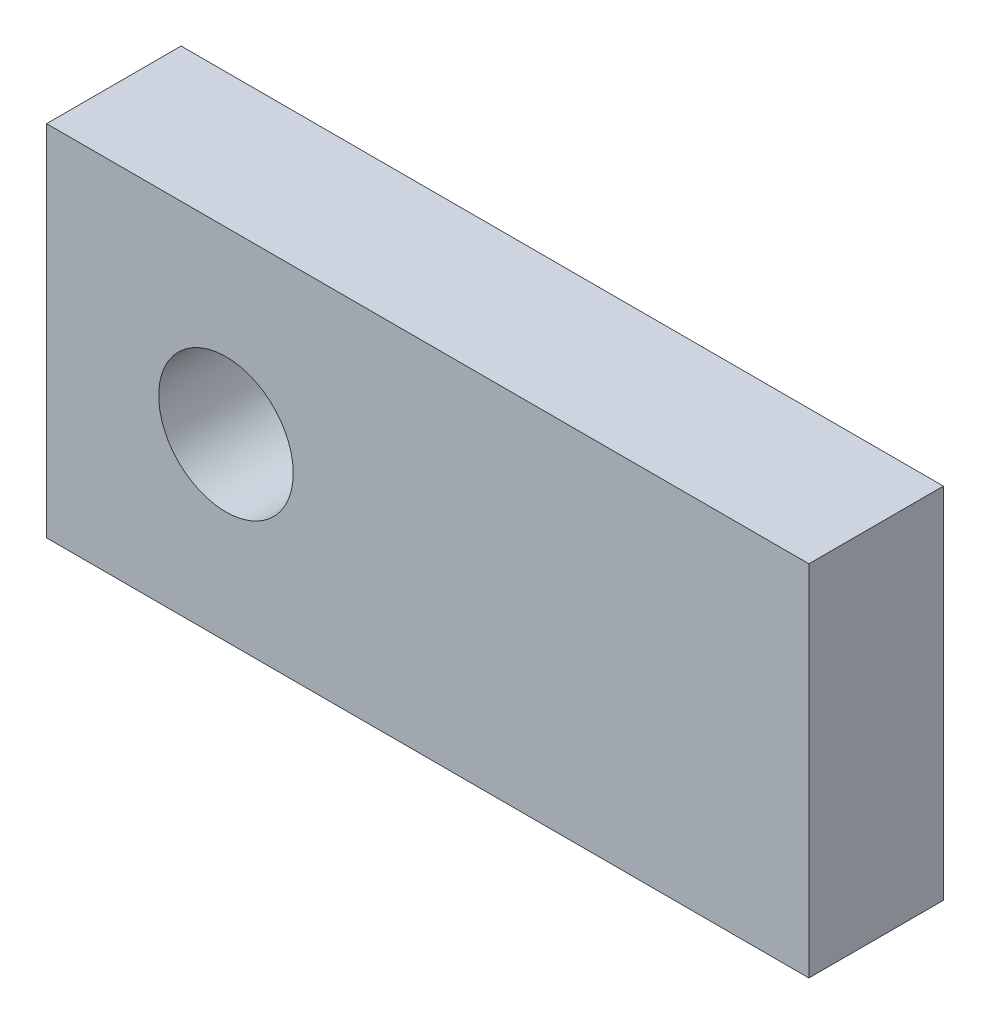
ISO-10303-21;
HEADER;
FILE_DESCRIPTION(('STEP AP214'),'2;1');
FILE_NAME('part.step','',(''),(''),'','','');
FILE_SCHEMA(('AUTOMOTIVE_DESIGN { 1 0 10303 214 1 1 1 1 }'));
ENDSEC;
DATA;
#1=APPLICATION_CONTEXT('core data for automotive mechanical design processes');
#2=APPLICATION_PROTOCOL_DEFINITION('international standard','automotive_design',2000,#1);
#3=PRODUCT_CONTEXT('',#1,'mechanical');
#4=PRODUCT('Part','Part','',(#3));
#5=PRODUCT_RELATED_PRODUCT_CATEGORY('part','',(#4));
#6=PRODUCT_DEFINITION_FORMATION('','',#4);
#7=PRODUCT_DEFINITION_CONTEXT('part definition',#1,'design');
#8=PRODUCT_DEFINITION('design','',#6,#7);
#9=PRODUCT_DEFINITION_SHAPE('','',#8);
#10=(LENGTH_UNIT() NAMED_UNIT(*) SI_UNIT(.MILLI.,.METRE.));
#11=(NAMED_UNIT(*) PLANE_ANGLE_UNIT() SI_UNIT($,.RADIAN.));
#12=(NAMED_UNIT(*) SI_UNIT($,.STERADIAN.) SOLID_ANGLE_UNIT());
#13=UNCERTAINTY_MEASURE_WITH_UNIT(LENGTH_MEASURE(1.E-05),#10,'distance_accuracy_value','');
#14=(GEOMETRIC_REPRESENTATION_CONTEXT(3) GLOBAL_UNCERTAINTY_ASSIGNED_CONTEXT((#13)) GLOBAL_UNIT_ASSIGNED_CONTEXT((#10,
#11,#12)) REPRESENTATION_CONTEXT('',''));
#15=CARTESIAN_POINT('',(0.,0.,0.));
#16=DIRECTION('',(0.,0.,1.));
#17=DIRECTION('',(1.,0.,0.));
#18=AXIS2_PLACEMENT_3D('',#15,#16,#17);
#19=CARTESIAN_POINT('',(0.,0.,3.));
#20=DIRECTION('',(1.,0.,0.));
#21=DIRECTION('',(0.,1.,0.));
#22=AXIS2_PLACEMENT_3D('',#19,#20,#21);
#23=PLANE('',#22);
#24=DIRECTION('',(0.,-1.,0.));
#25=VECTOR('',#24,1.);
#26=CARTESIAN_POINT('',(0.,0.,0.));
#27=LINE('',#26,#25);
#28=CARTESIAN_POINT('',(0.,8.,0.));
#29=VERTEX_POINT('',#28);
#30=CARTESIAN_POINT('',(0.,0.,0.));
#31=VERTEX_POINT('',#30);
#32=EDGE_CURVE('E98',#29,#31,#27,.T.);
#33=ORIENTED_EDGE('',*,*,#32,.T.);
#34=DIRECTION('',(0.,0.,-1.));
#35=VECTOR('',#34,1.);
#36=CARTESIAN_POINT('',(0.,0.,3.));
#37=LINE('',#36,#35);
#38=CARTESIAN_POINT('',(0.,0.,3.));
#39=VERTEX_POINT('',#38);
#40=EDGE_CURVE('E11',#39,#31,#37,.T.);
#41=ORIENTED_EDGE('',*,*,#40,.F.);
#42=DIRECTION('',(0.,-1.,0.));
#43=VECTOR('',#42,1.);
#44=CARTESIAN_POINT('',(0.,0.,3.));
#45=LINE('',#44,#43);
#46=CARTESIAN_POINT('',(0.,8.,3.));
#47=VERTEX_POINT('',#46);
#48=EDGE_CURVE('E86',#47,#39,#45,.T.);
#49=ORIENTED_EDGE('',*,*,#48,.F.);
#50=DIRECTION('',(0.,0.,-1.));
#51=VECTOR('',#50,1.);
#52=CARTESIAN_POINT('',(0.,8.,3.));
#53=LINE('',#52,#51);
#54=EDGE_CURVE('E94',#47,#29,#53,.T.);
#55=ORIENTED_EDGE('',*,*,#54,.T.);
#56=EDGE_LOOP('',(#33,#41,#49,#55));
#57=FACE_BOUND('',#56,.T.);
#58=ADVANCED_FACE('F35',(#57),#23,.F.);
#59=CARTESIAN_POINT('',(0.,0.,3.));
#60=DIRECTION('',(0.,1.,0.));
#61=DIRECTION('',(-1.,0.,0.));
#62=AXIS2_PLACEMENT_3D('',#59,#60,#61);
#63=PLANE('',#62);
#64=DIRECTION('',(1.,0.,0.));
#65=VECTOR('',#64,1.);
#66=CARTESIAN_POINT('',(0.,0.,0.));
#67=LINE('',#66,#65);
#68=CARTESIAN_POINT('',(17.,0.,0.));
#69=VERTEX_POINT('',#68);
#70=EDGE_CURVE('E90',#31,#69,#67,.T.);
#71=ORIENTED_EDGE('',*,*,#70,.T.);
#72=DIRECTION('',(0.,0.,-1.));
#73=VECTOR('',#72,1.);
#74=CARTESIAN_POINT('',(17.,0.,3.));
#75=LINE('',#74,#73);
#76=CARTESIAN_POINT('',(17.,0.,3.));
#77=VERTEX_POINT('',#76);
#78=EDGE_CURVE('E43',#77,#69,#75,.T.);
#79=ORIENTED_EDGE('',*,*,#78,.F.);
#80=DIRECTION('',(1.,0.,0.));
#81=VECTOR('',#80,1.);
#82=CARTESIAN_POINT('',(0.,0.,3.));
#83=LINE('',#82,#81);
#84=EDGE_CURVE('E81',#39,#77,#83,.T.);
#85=ORIENTED_EDGE('',*,*,#84,.F.);
#86=ORIENTED_EDGE('',*,*,#40,.T.);
#87=EDGE_LOOP('',(#71,#79,#85,#86));
#88=FACE_BOUND('',#87,.T.);
#89=ADVANCED_FACE('F89',(#88),#63,.F.);
#90=CARTESIAN_POINT('',(17.,0.,3.));
#91=DIRECTION('',(-1.,0.,0.));
#92=DIRECTION('',(0.,-1.,0.));
#93=AXIS2_PLACEMENT_3D('',#90,#91,#92);
#94=PLANE('',#93);
#95=DIRECTION('',(0.,1.,0.));
#96=VECTOR('',#95,1.);
#97=CARTESIAN_POINT('',(17.,0.,0.));
#98=LINE('',#97,#96);
#99=CARTESIAN_POINT('',(17.,8.,0.));
#100=VERTEX_POINT('',#99);
#101=EDGE_CURVE('E68',#69,#100,#98,.T.);
#102=ORIENTED_EDGE('',*,*,#101,.T.);
#103=DIRECTION('',(0.,0.,-1.));
#104=VECTOR('',#103,1.);
#105=CARTESIAN_POINT('',(17.,8.,3.));
#106=LINE('',#105,#104);
#107=CARTESIAN_POINT('',(17.,8.,3.));
#108=VERTEX_POINT('',#107);
#109=EDGE_CURVE('E91',#108,#100,#106,.T.);
#110=ORIENTED_EDGE('',*,*,#109,.F.);
#111=DIRECTION('',(0.,1.,0.));
#112=VECTOR('',#111,1.);
#113=CARTESIAN_POINT('',(17.,0.,3.));
#114=LINE('',#113,#112);
#115=EDGE_CURVE('E84',#77,#108,#114,.T.);
#116=ORIENTED_EDGE('',*,*,#115,.F.);
#117=ORIENTED_EDGE('',*,*,#78,.T.);
#118=EDGE_LOOP('',(#102,#110,#116,#117));
#119=FACE_BOUND('',#118,.T.);
#120=ADVANCED_FACE('F92',(#119),#94,.F.);
#121=CARTESIAN_POINT('',(0.,8.,3.));
#122=DIRECTION('',(0.,-1.,0.));
#123=DIRECTION('',(1.,0.,0.));
#124=AXIS2_PLACEMENT_3D('',#121,#122,#123);
#125=PLANE('',#124);
#126=DIRECTION('',(-1.,0.,0.));
#127=VECTOR('',#126,1.);
#128=CARTESIAN_POINT('',(0.,8.,0.));
#129=LINE('',#128,#127);
#130=EDGE_CURVE('E74',#100,#29,#129,.T.);
#131=ORIENTED_EDGE('',*,*,#130,.T.);
#132=ORIENTED_EDGE('',*,*,#54,.F.);
#133=DIRECTION('',(-1.,0.,0.));
#134=VECTOR('',#133,1.);
#135=CARTESIAN_POINT('',(0.,8.,3.));
#136=LINE('',#135,#134);
#137=EDGE_CURVE('E51',#108,#47,#136,.T.);
#138=ORIENTED_EDGE('',*,*,#137,.F.);
#139=ORIENTED_EDGE('',*,*,#109,.T.);
#140=EDGE_LOOP('',(#131,#132,#138,#139));
#141=FACE_BOUND('',#140,.T.);
#142=ADVANCED_FACE('F106',(#141),#125,.F.);
#143=CARTESIAN_POINT('',(0.,0.,3.));
#144=DIRECTION('',(0.,0.,-1.));
#145=DIRECTION('',(-1.,0.,0.));
#146=AXIS2_PLACEMENT_3D('',#143,#144,#145);
#147=PLANE('',#146);
#148=CARTESIAN_POINT('',(4.,4.,3.));
#149=DIRECTION('',(0.,0.,1.));
#150=DIRECTION('',(1.,0.,0.));
#151=AXIS2_PLACEMENT_3D('',#148,#149,#150);
#152=CIRCLE('',#151,1.5);
#153=CARTESIAN_POINT('',(5.5,4.,3.));
#154=VERTEX_POINT('',#153);
#155=EDGE_CURVE('E112',#154,#154,#152,.T.);
#156=ORIENTED_EDGE('',*,*,#155,.F.);
#157=EDGE_LOOP('',(#156));
#158=FACE_BOUND('',#157,.T.);
#159=ORIENTED_EDGE('',*,*,#48,.T.);
#160=ORIENTED_EDGE('',*,*,#84,.T.);
#161=ORIENTED_EDGE('',*,*,#115,.T.);
#162=ORIENTED_EDGE('',*,*,#137,.T.);
#163=EDGE_LOOP('',(#159,#160,#161,#162));
#164=FACE_BOUND('',#163,.T.);
#165=ADVANCED_FACE('F82',(#158,#164),#147,.F.);
#166=CARTESIAN_POINT('',(0.,0.,0.));
#167=DIRECTION('',(0.,0.,-1.));
#168=DIRECTION('',(-1.,0.,0.));
#169=AXIS2_PLACEMENT_3D('',#166,#167,#168);
#170=PLANE('',#169);
#171=CARTESIAN_POINT('',(4.,4.,0.));
#172=DIRECTION('',(0.,0.,1.));
#173=DIRECTION('',(1.,0.,0.));
#174=AXIS2_PLACEMENT_3D('',#171,#172,#173);
#175=CIRCLE('',#174,1.5);
#176=CARTESIAN_POINT('',(5.5,4.,0.));
#177=VERTEX_POINT('',#176);
#178=EDGE_CURVE('E101',#177,#177,#175,.T.);
#179=ORIENTED_EDGE('',*,*,#178,.T.);
#180=EDGE_LOOP('',(#179));
#181=FACE_BOUND('',#180,.T.);
#182=ORIENTED_EDGE('',*,*,#32,.F.);
#183=ORIENTED_EDGE('',*,*,#130,.F.);
#184=ORIENTED_EDGE('',*,*,#101,.F.);
#185=ORIENTED_EDGE('',*,*,#70,.F.);
#186=EDGE_LOOP('',(#182,#183,#184,#185));
#187=FACE_BOUND('',#186,.T.);
#188=ADVANCED_FACE('F109',(#181,#187),#170,.T.);
#189=CARTESIAN_POINT('',(4.,4.,0.));
#190=DIRECTION('',(0.,0.,1.));
#191=DIRECTION('',(1.,0.,0.));
#192=AXIS2_PLACEMENT_3D('',#189,#190,#191);
#193=CYLINDRICAL_SURFACE('',#192,1.5);
#194=ORIENTED_EDGE('',*,*,#178,.F.);
#195=EDGE_LOOP('',(#194));
#196=FACE_BOUND('',#195,.T.);
#197=ORIENTED_EDGE('',*,*,#155,.T.);
#198=EDGE_LOOP('',(#197));
#199=FACE_BOUND('',#198,.T.);
#200=ADVANCED_FACE('F119',(#196,#199),#193,.F.);
#201=CLOSED_SHELL('',(#58,#89,#120,#142,#165,#188,#200));
#202=MANIFOLD_SOLID_BREP('B2',#201);
#203=ADVANCED_BREP_SHAPE_REPRESENTATION('',(#18,#202),#14);
#204=SHAPE_DEFINITION_REPRESENTATION(#9,#203);
ENDSEC;
END-ISO-10303-21;
